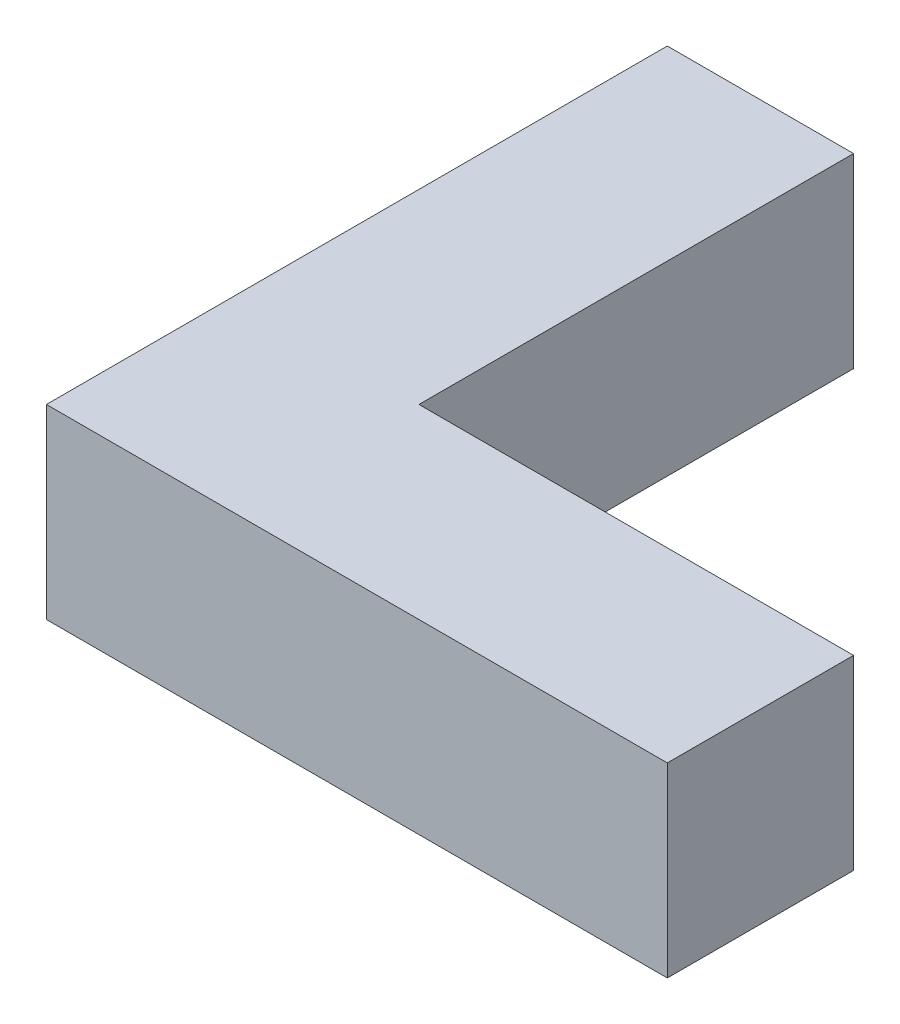
ISO-10303-21;
HEADER;
FILE_DESCRIPTION(('STEP AP214'),'2;1');
FILE_NAME('part.step','',(''),(''),'','','');
FILE_SCHEMA(('AUTOMOTIVE_DESIGN { 1 0 10303 214 1 1 1 1 }'));
ENDSEC;
DATA;
#1=APPLICATION_CONTEXT('core data for automotive mechanical design processes');
#2=APPLICATION_PROTOCOL_DEFINITION('international standard','automotive_design',2000,#1);
#3=PRODUCT_CONTEXT('',#1,'mechanical');
#4=PRODUCT('Part','Part','',(#3));
#5=PRODUCT_RELATED_PRODUCT_CATEGORY('part','',(#4));
#6=PRODUCT_DEFINITION_FORMATION('','',#4);
#7=PRODUCT_DEFINITION_CONTEXT('part definition',#1,'design');
#8=PRODUCT_DEFINITION('design','',#6,#7);
#9=PRODUCT_DEFINITION_SHAPE('','',#8);
#10=(LENGTH_UNIT() NAMED_UNIT(*) SI_UNIT(.MILLI.,.METRE.));
#11=(NAMED_UNIT(*) PLANE_ANGLE_UNIT() SI_UNIT($,.RADIAN.));
#12=(NAMED_UNIT(*) SI_UNIT($,.STERADIAN.) SOLID_ANGLE_UNIT());
#13=UNCERTAINTY_MEASURE_WITH_UNIT(LENGTH_MEASURE(1.E-05),#10,'distance_accuracy_value','');
#14=(GEOMETRIC_REPRESENTATION_CONTEXT(3) GLOBAL_UNCERTAINTY_ASSIGNED_CONTEXT((#13)) GLOBAL_UNIT_ASSIGNED_CONTEXT((#10,
#11,#12)) REPRESENTATION_CONTEXT('',''));
#15=CARTESIAN_POINT('',(0.,0.,0.));
#16=DIRECTION('',(0.,0.,1.));
#17=DIRECTION('',(1.,0.,0.));
#18=AXIS2_PLACEMENT_3D('',#15,#16,#17);
#19=CARTESIAN_POINT('',(10.,3.,0.));
#20=DIRECTION('',(0.,0.,-1.));
#21=DIRECTION('',(-1.,0.,0.));
#22=AXIS2_PLACEMENT_3D('',#19,#20,#21);
#23=PLANE('',#22);
#24=DIRECTION('',(1.,0.,0.));
#25=VECTOR('',#24,1.);
#26=CARTESIAN_POINT('',(10.,0.,0.));
#27=LINE('',#26,#25);
#28=CARTESIAN_POINT('',(0.,0.,0.));
#29=VERTEX_POINT('',#28);
#30=CARTESIAN_POINT('',(10.,0.,0.));
#31=VERTEX_POINT('',#30);
#32=EDGE_CURVE('E121',#29,#31,#27,.T.);
#33=ORIENTED_EDGE('',*,*,#32,.T.);
#34=DIRECTION('',(0.,-1.,0.));
#35=VECTOR('',#34,1.);
#36=CARTESIAN_POINT('',(10.,3.,0.));
#37=LINE('',#36,#35);
#38=CARTESIAN_POINT('',(10.,3.,0.));
#39=VERTEX_POINT('',#38);
#40=EDGE_CURVE('E11',#39,#31,#37,.T.);
#41=ORIENTED_EDGE('',*,*,#40,.F.);
#42=DIRECTION('',(1.,0.,0.));
#43=VECTOR('',#42,1.);
#44=CARTESIAN_POINT('',(10.,3.,0.));
#45=LINE('',#44,#43);
#46=CARTESIAN_POINT('',(0.,3.,0.));
#47=VERTEX_POINT('',#46);
#48=EDGE_CURVE('E131',#47,#39,#45,.T.);
#49=ORIENTED_EDGE('',*,*,#48,.F.);
#50=DIRECTION('',(0.,-1.,0.));
#51=VECTOR('',#50,1.);
#52=CARTESIAN_POINT('',(0.,3.,0.));
#53=LINE('',#52,#51);
#54=EDGE_CURVE('E117',#47,#29,#53,.T.);
#55=ORIENTED_EDGE('',*,*,#54,.T.);
#56=EDGE_LOOP('',(#33,#41,#49,#55));
#57=FACE_BOUND('',#56,.T.);
#58=ADVANCED_FACE('F37',(#57),#23,.F.);
#59=CARTESIAN_POINT('',(10.,3.,-3.));
#60=DIRECTION('',(-1.,0.,0.));
#61=DIRECTION('',(0.,0.,1.));
#62=AXIS2_PLACEMENT_3D('',#59,#60,#61);
#63=PLANE('',#62);
#64=DIRECTION('',(0.,0.,-1.));
#65=VECTOR('',#64,1.);
#66=CARTESIAN_POINT('',(10.,0.,-3.));
#67=LINE('',#66,#65);
#68=CARTESIAN_POINT('',(10.,0.,-3.));
#69=VERTEX_POINT('',#68);
#70=EDGE_CURVE('E124',#31,#69,#67,.T.);
#71=ORIENTED_EDGE('',*,*,#70,.T.);
#72=DIRECTION('',(0.,-1.,0.));
#73=VECTOR('',#72,1.);
#74=CARTESIAN_POINT('',(10.,3.,-3.));
#75=LINE('',#74,#73);
#76=CARTESIAN_POINT('',(10.,3.,-3.));
#77=VERTEX_POINT('',#76);
#78=EDGE_CURVE('E45',#77,#69,#75,.T.);
#79=ORIENTED_EDGE('',*,*,#78,.F.);
#80=DIRECTION('',(0.,0.,-1.));
#81=VECTOR('',#80,1.);
#82=CARTESIAN_POINT('',(10.,3.,-3.));
#83=LINE('',#82,#81);
#84=EDGE_CURVE('E90',#39,#77,#83,.T.);
#85=ORIENTED_EDGE('',*,*,#84,.F.);
#86=ORIENTED_EDGE('',*,*,#40,.T.);
#87=EDGE_LOOP('',(#71,#79,#85,#86));
#88=FACE_BOUND('',#87,.T.);
#89=ADVANCED_FACE('F155',(#88),#63,.F.);
#90=CARTESIAN_POINT('',(3.,3.,-3.));
#91=DIRECTION('',(0.,0.,1.));
#92=DIRECTION('',(1.,0.,0.));
#93=AXIS2_PLACEMENT_3D('',#90,#91,#92);
#94=PLANE('',#93);
#95=DIRECTION('',(-1.,0.,0.));
#96=VECTOR('',#95,1.);
#97=CARTESIAN_POINT('',(3.,0.,-3.));
#98=LINE('',#97,#96);
#99=CARTESIAN_POINT('',(3.,0.,-3.));
#100=VERTEX_POINT('',#99);
#101=EDGE_CURVE('E126',#69,#100,#98,.T.);
#102=ORIENTED_EDGE('',*,*,#101,.T.);
#103=DIRECTION('',(0.,-1.,0.));
#104=VECTOR('',#103,1.);
#105=CARTESIAN_POINT('',(3.,3.,-3.));
#106=LINE('',#105,#104);
#107=CARTESIAN_POINT('',(3.,3.,-3.));
#108=VERTEX_POINT('',#107);
#109=EDGE_CURVE('E112',#108,#100,#106,.T.);
#110=ORIENTED_EDGE('',*,*,#109,.F.);
#111=DIRECTION('',(-1.,0.,0.));
#112=VECTOR('',#111,1.);
#113=CARTESIAN_POINT('',(3.,3.,-3.));
#114=LINE('',#113,#112);
#115=EDGE_CURVE('E103',#77,#108,#114,.T.);
#116=ORIENTED_EDGE('',*,*,#115,.F.);
#117=ORIENTED_EDGE('',*,*,#78,.T.);
#118=EDGE_LOOP('',(#102,#110,#116,#117));
#119=FACE_BOUND('',#118,.T.);
#120=ADVANCED_FACE('F137',(#119),#94,.F.);
#121=CARTESIAN_POINT('',(3.,3.,-10.));
#122=DIRECTION('',(-1.,0.,0.));
#123=DIRECTION('',(0.,0.,1.));
#124=AXIS2_PLACEMENT_3D('',#121,#122,#123);
#125=PLANE('',#124);
#126=DIRECTION('',(0.,0.,-1.));
#127=VECTOR('',#126,1.);
#128=CARTESIAN_POINT('',(3.,0.,-10.));
#129=LINE('',#128,#127);
#130=CARTESIAN_POINT('',(3.,0.,-10.));
#131=VERTEX_POINT('',#130);
#132=EDGE_CURVE('E111',#100,#131,#129,.T.);
#133=ORIENTED_EDGE('',*,*,#132,.T.);
#134=DIRECTION('',(0.,-1.,0.));
#135=VECTOR('',#134,1.);
#136=CARTESIAN_POINT('',(3.,3.,-10.));
#137=LINE('',#136,#135);
#138=CARTESIAN_POINT('',(3.,3.,-10.));
#139=VERTEX_POINT('',#138);
#140=EDGE_CURVE('E108',#139,#131,#137,.T.);
#141=ORIENTED_EDGE('',*,*,#140,.F.);
#142=DIRECTION('',(0.,0.,-1.));
#143=VECTOR('',#142,1.);
#144=CARTESIAN_POINT('',(3.,3.,-10.));
#145=LINE('',#144,#143);
#146=EDGE_CURVE('E97',#108,#139,#145,.T.);
#147=ORIENTED_EDGE('',*,*,#146,.F.);
#148=ORIENTED_EDGE('',*,*,#109,.T.);
#149=EDGE_LOOP('',(#133,#141,#147,#148));
#150=FACE_BOUND('',#149,.T.);
#151=ADVANCED_FACE('F109',(#150),#125,.F.);
#152=CARTESIAN_POINT('',(0.,3.,-10.));
#153=DIRECTION('',(0.,0.,1.));
#154=DIRECTION('',(1.,0.,0.));
#155=AXIS2_PLACEMENT_3D('',#152,#153,#154);
#156=PLANE('',#155);
#157=DIRECTION('',(-1.,0.,0.));
#158=VECTOR('',#157,1.);
#159=CARTESIAN_POINT('',(0.,0.,-10.));
#160=LINE('',#159,#158);
#161=CARTESIAN_POINT('',(0.,0.,-10.));
#162=VERTEX_POINT('',#161);
#163=EDGE_CURVE('E76',#131,#162,#160,.T.);
#164=ORIENTED_EDGE('',*,*,#163,.T.);
#165=DIRECTION('',(0.,-1.,0.));
#166=VECTOR('',#165,1.);
#167=CARTESIAN_POINT('',(0.,3.,-10.));
#168=LINE('',#167,#166);
#169=CARTESIAN_POINT('',(0.,3.,-10.));
#170=VERTEX_POINT('',#169);
#171=EDGE_CURVE('E113',#170,#162,#168,.T.);
#172=ORIENTED_EDGE('',*,*,#171,.F.);
#173=DIRECTION('',(-1.,0.,0.));
#174=VECTOR('',#173,1.);
#175=CARTESIAN_POINT('',(0.,3.,-10.));
#176=LINE('',#175,#174);
#177=EDGE_CURVE('E101',#139,#170,#176,.T.);
#178=ORIENTED_EDGE('',*,*,#177,.F.);
#179=ORIENTED_EDGE('',*,*,#140,.T.);
#180=EDGE_LOOP('',(#164,#172,#178,#179));
#181=FACE_BOUND('',#180,.T.);
#182=ADVANCED_FACE('F115',(#181),#156,.F.);
#183=CARTESIAN_POINT('',(0.,3.,0.));
#184=DIRECTION('',(1.,0.,0.));
#185=DIRECTION('',(0.,0.,-1.));
#186=AXIS2_PLACEMENT_3D('',#183,#184,#185);
#187=PLANE('',#186);
#188=DIRECTION('',(0.,0.,1.));
#189=VECTOR('',#188,1.);
#190=CARTESIAN_POINT('',(0.,0.,0.));
#191=LINE('',#190,#189);
#192=EDGE_CURVE('E82',#162,#29,#191,.T.);
#193=ORIENTED_EDGE('',*,*,#192,.T.);
#194=ORIENTED_EDGE('',*,*,#54,.F.);
#195=DIRECTION('',(0.,0.,1.));
#196=VECTOR('',#195,1.);
#197=CARTESIAN_POINT('',(0.,3.,0.));
#198=LINE('',#197,#196);
#199=EDGE_CURVE('E53',#170,#47,#198,.T.);
#200=ORIENTED_EDGE('',*,*,#199,.F.);
#201=ORIENTED_EDGE('',*,*,#171,.T.);
#202=EDGE_LOOP('',(#193,#194,#200,#201));
#203=FACE_BOUND('',#202,.T.);
#204=ADVANCED_FACE('F144',(#203),#187,.F.);
#205=CARTESIAN_POINT('',(0.,3.,0.));
#206=DIRECTION('',(0.,-1.,0.));
#207=DIRECTION('',(0.,0.,-1.));
#208=AXIS2_PLACEMENT_3D('',#205,#206,#207);
#209=PLANE('',#208);
#210=ORIENTED_EDGE('',*,*,#48,.T.);
#211=ORIENTED_EDGE('',*,*,#84,.T.);
#212=ORIENTED_EDGE('',*,*,#115,.T.);
#213=ORIENTED_EDGE('',*,*,#146,.T.);
#214=ORIENTED_EDGE('',*,*,#177,.T.);
#215=ORIENTED_EDGE('',*,*,#199,.T.);
#216=EDGE_LOOP('',(#210,#211,#212,#213,#214,#215));
#217=FACE_BOUND('',#216,.T.);
#218=ADVANCED_FACE('F99',(#217),#209,.F.);
#219=CARTESIAN_POINT('',(0.,0.,0.));
#220=DIRECTION('',(0.,-1.,0.));
#221=DIRECTION('',(0.,0.,-1.));
#222=AXIS2_PLACEMENT_3D('',#219,#220,#221);
#223=PLANE('',#222);
#224=ORIENTED_EDGE('',*,*,#32,.F.);
#225=ORIENTED_EDGE('',*,*,#192,.F.);
#226=ORIENTED_EDGE('',*,*,#163,.F.);
#227=ORIENTED_EDGE('',*,*,#132,.F.);
#228=ORIENTED_EDGE('',*,*,#101,.F.);
#229=ORIENTED_EDGE('',*,*,#70,.F.);
#230=EDGE_LOOP('',(#224,#225,#226,#227,#228,#229));
#231=FACE_BOUND('',#230,.T.);
#232=ADVANCED_FACE('F140',(#231),#223,.T.);
#233=CLOSED_SHELL('',(#58,#89,#120,#151,#182,#204,#218,#232));
#234=MANIFOLD_SOLID_BREP('B2',#233);
#235=ADVANCED_BREP_SHAPE_REPRESENTATION('',(#18,#234),#14);
#236=SHAPE_DEFINITION_REPRESENTATION(#9,#235);
ENDSEC;
END-ISO-10303-21;
